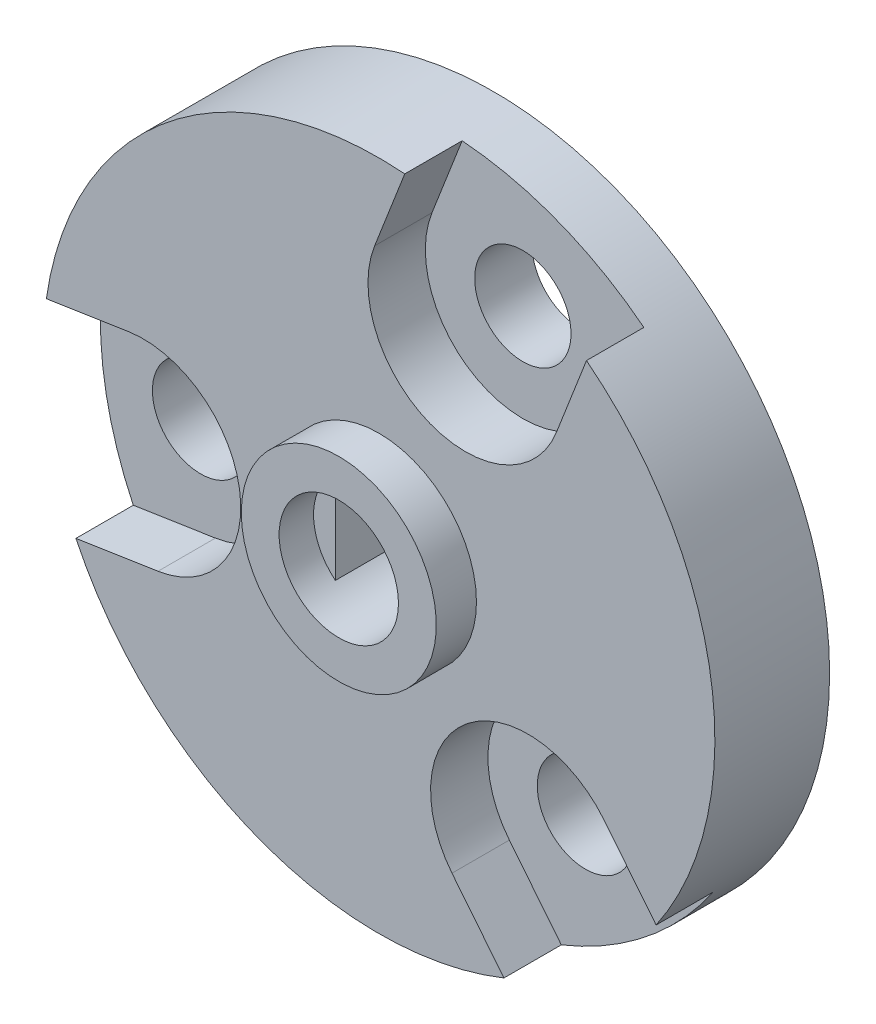
ISO-10303-21;
HEADER;
FILE_DESCRIPTION(('STEP AP214'),'2;1');
FILE_NAME('part.step','',(''),(''),'','','');
FILE_SCHEMA(('AUTOMOTIVE_DESIGN { 1 0 10303 214 1 1 1 1 }'));
ENDSEC;
DATA;
#1=APPLICATION_CONTEXT('core data for automotive mechanical design processes');
#2=APPLICATION_PROTOCOL_DEFINITION('international standard','automotive_design',2000,#1);
#3=PRODUCT_CONTEXT('',#1,'mechanical');
#4=PRODUCT('Part','Part','',(#3));
#5=PRODUCT_RELATED_PRODUCT_CATEGORY('part','',(#4));
#6=PRODUCT_DEFINITION_FORMATION('','',#4);
#7=PRODUCT_DEFINITION_CONTEXT('part definition',#1,'design');
#8=PRODUCT_DEFINITION('design','',#6,#7);
#9=PRODUCT_DEFINITION_SHAPE('','',#8);
#10=(LENGTH_UNIT() NAMED_UNIT(*) SI_UNIT(.MILLI.,.METRE.));
#11=(NAMED_UNIT(*) PLANE_ANGLE_UNIT() SI_UNIT($,.RADIAN.));
#12=(NAMED_UNIT(*) SI_UNIT($,.STERADIAN.) SOLID_ANGLE_UNIT());
#13=UNCERTAINTY_MEASURE_WITH_UNIT(LENGTH_MEASURE(1.E-05),#10,'distance_accuracy_value','');
#14=(GEOMETRIC_REPRESENTATION_CONTEXT(3) GLOBAL_UNCERTAINTY_ASSIGNED_CONTEXT((#13)) GLOBAL_UNIT_ASSIGNED_CONTEXT((#10,
#11,#12)) REPRESENTATION_CONTEXT('',''));
#15=CARTESIAN_POINT('',(0.,0.,0.));
#16=DIRECTION('',(0.,0.,1.));
#17=DIRECTION('',(1.,0.,0.));
#18=AXIS2_PLACEMENT_3D('',#15,#16,#17);
#19=CARTESIAN_POINT('',(0.,0.,5.25));
#20=DIRECTION('',(0.,0.,1.));
#21=DIRECTION('',(1.,0.,0.));
#22=AXIS2_PLACEMENT_3D('',#19,#20,#21);
#23=PLANE('',#22);
#24=CARTESIAN_POINT('',(0.,0.,5.25));
#25=DIRECTION('',(0.,0.,1.));
#26=DIRECTION('',(1.,0.,0.));
#27=AXIS2_PLACEMENT_3D('',#24,#25,#26);
#28=CIRCLE('',#27,2.6);
#29=CARTESIAN_POINT('',(1.65,-2.00935312974101,5.25));
#30=VERTEX_POINT('',#29);
#31=CARTESIAN_POINT('',(1.65,2.00935312974101,5.25));
#32=VERTEX_POINT('',#31);
#33=EDGE_CURVE('E164',#30,#32,#28,.T.);
#34=ORIENTED_EDGE('',*,*,#33,.T.);
#35=DIRECTION('',(0.,-1.,0.));
#36=VECTOR('',#35,1.);
#37=CARTESIAN_POINT('',(1.65,-2.00935312974102,5.25));
#38=LINE('',#37,#36);
#39=EDGE_CURVE('E150',#32,#30,#38,.T.);
#40=ORIENTED_EDGE('',*,*,#39,.T.);
#41=EDGE_LOOP('',(#34,#40));
#42=FACE_BOUND('',#41,.T.);
#43=ADVANCED_FACE('F36',(#42),#23,.T.);
#44=CARTESIAN_POINT('',(-1.65,2.00935312974101,5.25));
#45=VERTEX_POINT('',#44);
#46=CARTESIAN_POINT('',(-1.65,-2.00935312974101,5.25));
#47=VERTEX_POINT('',#46);
#48=EDGE_CURVE('E169',#45,#47,#28,.T.);
#49=ORIENTED_EDGE('',*,*,#48,.T.);
#50=DIRECTION('',(0.,1.,0.));
#51=VECTOR('',#50,1.);
#52=CARTESIAN_POINT('',(-1.65,2.00935312974101,5.25));
#53=LINE('',#52,#51);
#54=EDGE_CURVE('E168',#47,#45,#53,.T.);
#55=ORIENTED_EDGE('',*,*,#54,.T.);
#56=EDGE_LOOP('',(#49,#55));
#57=FACE_BOUND('',#56,.T.);
#58=ADVANCED_FACE('F348',(#57),#23,.T.);
#59=CARTESIAN_POINT('',(-10.272271600733,-1.5749400498987,5.));
#60=DIRECTION('',(0.,0.,1.));
#61=DIRECTION('',(1.,0.,0.));
#62=AXIS2_PLACEMENT_3D('',#59,#60,#61);
#63=PLANE('',#62);
#64=CARTESIAN_POINT('',(-10.272271600733,-1.5749400498987,5.));
#65=DIRECTION('',(0.,0.,-1.));
#66=DIRECTION('',(1.,0.,0.));
#67=AXIS2_PLACEMENT_3D('',#64,#65,#66);
#68=CIRCLE('',#67,4.24999999999999);
#69=CARTESIAN_POINT('',(-10.9163534778176,2.62597158159405,5.));
#70=VERTEX_POINT('',#69);
#71=CARTESIAN_POINT('',(-9.62818972364833,-5.77585168139145,5.));
#72=VERTEX_POINT('',#71);
#73=EDGE_CURVE('E301',#70,#72,#68,.T.);
#74=ORIENTED_EDGE('',*,*,#73,.T.);
#75=DIRECTION('',(-0.988449795645354,-0.151548676961091,0.));
#76=VECTOR('',#75,1.);
#77=CARTESIAN_POINT('',(-9.62818972364833,-5.77585168139145,5.));
#78=LINE('',#77,#76);
#79=CARTESIAN_POINT('',(-13.2060218892404,-6.32440329572032,5.));
#80=VERTEX_POINT('',#79);
#81=EDGE_CURVE('E299',#72,#80,#78,.T.);
#82=ORIENTED_EDGE('',*,*,#81,.T.);
#83=CARTESIAN_POINT('',(0.,0.,5.));
#84=DIRECTION('',(0.,0.,1.));
#85=DIRECTION('',(1.,0.,0.));
#86=AXIS2_PLACEMENT_3D('',#83,#84,#85);
#87=CIRCLE('',#86,14.6423048454133);
#88=CARTESIAN_POINT('',(5.44799435572411,-13.591042957993,5.));
#89=VERTEX_POINT('',#88);
#90=EDGE_CURVE('E297',#80,#89,#87,.T.);
#91=ORIENTED_EDGE('',*,*,#90,.T.);
#92=DIRECTION('',(-0.625469901980902,0.780248294913869,0.));
#93=VECTOR('',#92,1.);
#94=CARTESIAN_POINT('',(5.44799435572411,-13.591042957993,5.));
#95=LINE('',#94,#93);
#96=CARTESIAN_POINT('',(3.18401863963234,-10.7668252192777,5.));
#97=VERTEX_POINT('',#96);
#98=EDGE_CURVE('E295',#89,#97,#95,.T.);
#99=ORIENTED_EDGE('',*,*,#98,.T.);
#100=CARTESIAN_POINT('',(6.5000738930163,-8.10857813585883,5.));
#101=DIRECTION('',(0.,0.,-1.));
#102=DIRECTION('',(1.,0.,0.));
#103=AXIS2_PLACEMENT_3D('',#100,#101,#102);
#104=CIRCLE('',#103,4.25000000000001);
#105=CARTESIAN_POINT('',(9.81612914640025,-5.45033105243999,5.));
#106=VERTEX_POINT('',#105);
#107=EDGE_CURVE('E293',#97,#106,#104,.T.);
#108=ORIENTED_EDGE('',*,*,#107,.T.);
#109=DIRECTION('',(0.625469901980903,-0.780248294913869,0.));
#110=VECTOR('',#109,1.);
#111=CARTESIAN_POINT('',(12.080104862492,-8.27454879115533,5.));
#112=LINE('',#111,#110);
#113=CARTESIAN_POINT('',(12.080104862492,-8.27454879115533,5.));
#114=VERTEX_POINT('',#113);
#115=EDGE_CURVE('E291',#106,#114,#112,.T.);
#116=ORIENTED_EDGE('',*,*,#115,.T.);
#117=CARTESIAN_POINT('',(0.,0.,5.));
#118=DIRECTION('',(0.,0.,1.));
#119=DIRECTION('',(1.,0.,0.));
#120=AXIS2_PLACEMENT_3D('',#117,#118,#119);
#121=CIRCLE('',#120,14.6423048454133);
#122=CARTESIAN_POINT('',(9.04619128768549,11.5136229907278,5.));
#123=VERTEX_POINT('',#122);
#124=EDGE_CURVE('E289',#114,#123,#121,.T.);
#125=ORIENTED_EDGE('',*,*,#124,.T.);
#126=DIRECTION('',(-0.36297989366445,-0.93179697187496,0.));
#127=VECTOR('',#126,1.);
#128=CARTESIAN_POINT('',(9.04619128768549,11.5136229907278,5.));
#129=LINE('',#128,#127);
#130=CARTESIAN_POINT('',(7.73233483818526,8.14085363768363,5.));
#131=VERTEX_POINT('',#130);
#132=EDGE_CURVE('E287',#123,#131,#129,.T.);
#133=ORIENTED_EDGE('',*,*,#132,.T.);
#134=CARTESIAN_POINT('',(3.77219770771667,9.68351818575755,5.));
#135=DIRECTION('',(0.,0.,-1.));
#136=DIRECTION('',(1.,0.,0.));
#137=AXIS2_PLACEMENT_3D('',#134,#135,#136);
#138=CIRCLE('',#137,4.25000000000001);
#139=CARTESIAN_POINT('',(-0.187939422751923,11.2261827338315,5.));
#140=VERTEX_POINT('',#139);
#141=EDGE_CURVE('E285',#131,#140,#138,.T.);
#142=ORIENTED_EDGE('',*,*,#141,.T.);
#143=DIRECTION('',(0.362979893664451,0.931796971874959,0.));
#144=VECTOR('',#143,1.);
#145=CARTESIAN_POINT('',(1.12591702674831,14.5989520868757,5.));
#146=LINE('',#145,#144);
#147=CARTESIAN_POINT('',(1.12591702674831,14.5989520868757,5.));
#148=VERTEX_POINT('',#147);
#149=EDGE_CURVE('E283',#140,#148,#146,.T.);
#150=ORIENTED_EDGE('',*,*,#149,.T.);
#151=CARTESIAN_POINT('',(0.,0.,5.));
#152=DIRECTION('',(0.,0.,1.));
#153=DIRECTION('',(1.,0.,0.));
#154=AXIS2_PLACEMENT_3D('',#151,#152,#153);
#155=CIRCLE('',#154,14.6423048454133);
#156=CARTESIAN_POINT('',(-14.4941856434096,2.07741996726518,5.));
#157=VERTEX_POINT('',#156);
#158=EDGE_CURVE('E281',#148,#157,#155,.T.);
#159=ORIENTED_EDGE('',*,*,#158,.T.);
#160=DIRECTION('',(0.988449795645354,0.15154867696109,0.));
#161=VECTOR('',#160,1.);
#162=CARTESIAN_POINT('',(-10.9163534778176,2.62597158159405,5.));
#163=LINE('',#162,#161);
#164=EDGE_CURVE('E279',#157,#70,#163,.T.);
#165=ORIENTED_EDGE('',*,*,#164,.T.);
#166=EDGE_LOOP('',(#74,#82,#91,#99,#108,#116,#125,#133,#142,#150,#159,#165));
#167=FACE_BOUND('',#166,.T.);
#168=CARTESIAN_POINT('',(0.,0.,5.));
#169=DIRECTION('',(0.,0.,1.));
#170=DIRECTION('',(1.,0.,0.));
#171=AXIS2_PLACEMENT_3D('',#168,#169,#170);
#172=CIRCLE('',#171,4.25);
#173=CARTESIAN_POINT('',(4.25,0.,5.));
#174=VERTEX_POINT('',#173);
#175=EDGE_CURVE('E306',#174,#174,#172,.T.);
#176=ORIENTED_EDGE('',*,*,#175,.F.);
#177=EDGE_LOOP('',(#176));
#178=FACE_BOUND('',#177,.T.);
#179=ADVANCED_FACE('F350',(#167,#178),#63,.T.);
#180=CARTESIAN_POINT('',(0.,0.,2.5));
#181=DIRECTION('',(0.,0.,1.));
#182=DIRECTION('',(1.,0.,0.));
#183=AXIS2_PLACEMENT_3D('',#180,#181,#182);
#184=PLANE('',#183);
#185=CARTESIAN_POINT('',(3.77219770771667,9.68351818575755,2.5));
#186=DIRECTION('',(0.,0.,1.));
#187=DIRECTION('',(1.,0.,0.));
#188=AXIS2_PLACEMENT_3D('',#185,#186,#187);
#189=CIRCLE('',#188,2.1);
#190=CARTESIAN_POINT('',(5.87219770771667,9.68351818575755,2.5));
#191=VERTEX_POINT('',#190);
#192=EDGE_CURVE('E310',#191,#191,#189,.T.);
#193=ORIENTED_EDGE('',*,*,#192,.F.);
#194=EDGE_LOOP('',(#193));
#195=FACE_BOUND('',#194,.T.);
#196=DIRECTION('',(0.362979893664451,0.931796971874959,0.));
#197=VECTOR('',#196,1.);
#198=CARTESIAN_POINT('',(1.12591702674831,14.5989520868757,2.5));
#199=LINE('',#198,#197);
#200=CARTESIAN_POINT('',(-0.187939422751923,11.2261827338315,2.5));
#201=VERTEX_POINT('',#200);
#202=CARTESIAN_POINT('',(1.12591702674831,14.5989520868757,2.5));
#203=VERTEX_POINT('',#202);
#204=EDGE_CURVE('E219',#201,#203,#199,.T.);
#205=ORIENTED_EDGE('',*,*,#204,.F.);
#206=CARTESIAN_POINT('',(3.77219770771667,9.68351818575755,2.5));
#207=DIRECTION('',(0.,0.,-1.));
#208=DIRECTION('',(1.,0.,0.));
#209=AXIS2_PLACEMENT_3D('',#206,#207,#208);
#210=CIRCLE('',#209,4.25000000000001);
#211=CARTESIAN_POINT('',(7.73233483818526,8.14085363768363,2.5));
#212=VERTEX_POINT('',#211);
#213=EDGE_CURVE('E216',#212,#201,#210,.T.);
#214=ORIENTED_EDGE('',*,*,#213,.F.);
#215=DIRECTION('',(-0.36297989366445,-0.93179697187496,0.));
#216=VECTOR('',#215,1.);
#217=CARTESIAN_POINT('',(9.04619128768549,11.5136229907278,2.5));
#218=LINE('',#217,#216);
#219=CARTESIAN_POINT('',(9.04619128768549,11.5136229907278,2.5));
#220=VERTEX_POINT('',#219);
#221=EDGE_CURVE('E209',#220,#212,#218,.T.);
#222=ORIENTED_EDGE('',*,*,#221,.F.);
#223=CARTESIAN_POINT('',(0.,0.,2.5));
#224=DIRECTION('',(0.,0.,1.));
#225=DIRECTION('',(1.,0.,0.));
#226=AXIS2_PLACEMENT_3D('',#223,#224,#225);
#227=CIRCLE('',#226,14.6423048454133);
#228=EDGE_CURVE('E12',#220,#203,#227,.T.);
#229=ORIENTED_EDGE('',*,*,#228,.T.);
#230=EDGE_LOOP('',(#205,#214,#222,#229));
#231=FACE_BOUND('',#230,.T.);
#232=ADVANCED_FACE('F356',(#195,#231),#184,.T.);
#233=CARTESIAN_POINT('',(6.5000738930163,-8.10857813585883,2.5));
#234=DIRECTION('',(0.,0.,1.));
#235=DIRECTION('',(1.,0.,0.));
#236=AXIS2_PLACEMENT_3D('',#233,#234,#235);
#237=CIRCLE('',#236,2.1);
#238=CARTESIAN_POINT('',(8.6000738930163,-8.10857813585883,2.5));
#239=VERTEX_POINT('',#238);
#240=EDGE_CURVE('E173',#239,#239,#237,.T.);
#241=ORIENTED_EDGE('',*,*,#240,.F.);
#242=EDGE_LOOP('',(#241));
#243=FACE_BOUND('',#242,.T.);
#244=DIRECTION('',(0.625469901980903,-0.780248294913869,0.));
#245=VECTOR('',#244,1.);
#246=CARTESIAN_POINT('',(12.080104862492,-8.27454879115533,2.5));
#247=LINE('',#246,#245);
#248=CARTESIAN_POINT('',(9.81612914640025,-5.45033105243999,2.5));
#249=VERTEX_POINT('',#248);
#250=CARTESIAN_POINT('',(12.080104862492,-8.27454879115533,2.5));
#251=VERTEX_POINT('',#250);
#252=EDGE_CURVE('E205',#249,#251,#247,.T.);
#253=ORIENTED_EDGE('',*,*,#252,.F.);
#254=CARTESIAN_POINT('',(6.5000738930163,-8.10857813585883,2.5));
#255=DIRECTION('',(0.,0.,-1.));
#256=DIRECTION('',(1.,0.,0.));
#257=AXIS2_PLACEMENT_3D('',#254,#255,#256);
#258=CIRCLE('',#257,4.25000000000001);
#259=CARTESIAN_POINT('',(3.18401863963234,-10.7668252192777,2.5));
#260=VERTEX_POINT('',#259);
#261=EDGE_CURVE('E196',#260,#249,#258,.T.);
#262=ORIENTED_EDGE('',*,*,#261,.F.);
#263=DIRECTION('',(-0.625469901980902,0.780248294913869,0.));
#264=VECTOR('',#263,1.);
#265=CARTESIAN_POINT('',(5.44799435572411,-13.591042957993,2.5));
#266=LINE('',#265,#264);
#267=CARTESIAN_POINT('',(5.44799435572412,-13.591042957993,2.5));
#268=VERTEX_POINT('',#267);
#269=EDGE_CURVE('E193',#268,#260,#266,.T.);
#270=ORIENTED_EDGE('',*,*,#269,.F.);
#271=EDGE_CURVE('E262',#268,#251,#227,.T.);
#272=ORIENTED_EDGE('',*,*,#271,.T.);
#273=EDGE_LOOP('',(#253,#262,#270,#272));
#274=FACE_BOUND('',#273,.T.);
#275=ADVANCED_FACE('F421',(#243,#274),#184,.T.);
#276=CARTESIAN_POINT('',(0.,0.,2.5));
#277=DIRECTION('',(0.,0.,-1.));
#278=DIRECTION('',(-1.,0.,0.));
#279=AXIS2_PLACEMENT_3D('',#276,#277,#278);
#280=CYLINDRICAL_SURFACE('',#279,14.6423048454133);
#281=ORIENTED_EDGE('',*,*,#228,.F.);
#282=DIRECTION('',(0.,0.,-1.));
#283=VECTOR('',#282,1.);
#284=CARTESIAN_POINT('',(9.04619128768549,11.5136229907278,5.));
#285=LINE('',#284,#283);
#286=EDGE_CURVE('E204',#123,#220,#285,.T.);
#287=ORIENTED_EDGE('',*,*,#286,.F.);
#288=ORIENTED_EDGE('',*,*,#124,.F.);
#289=DIRECTION('',(0.,0.,-1.));
#290=VECTOR('',#289,1.);
#291=CARTESIAN_POINT('',(12.080104862492,-8.27454879115533,5.));
#292=LINE('',#291,#290);
#293=EDGE_CURVE('E200',#114,#251,#292,.T.);
#294=ORIENTED_EDGE('',*,*,#293,.T.);
#295=ORIENTED_EDGE('',*,*,#271,.F.);
#296=DIRECTION('',(0.,0.,-1.));
#297=VECTOR('',#296,1.);
#298=CARTESIAN_POINT('',(5.44799435572411,-13.591042957993,5.));
#299=LINE('',#298,#297);
#300=EDGE_CURVE('E186',#89,#268,#299,.T.);
#301=ORIENTED_EDGE('',*,*,#300,.F.);
#302=ORIENTED_EDGE('',*,*,#90,.F.);
#303=DIRECTION('',(0.,0.,-1.));
#304=VECTOR('',#303,1.);
#305=CARTESIAN_POINT('',(-13.2060218892404,-6.32440329572032,5.));
#306=LINE('',#305,#304);
#307=CARTESIAN_POINT('',(-13.2060218892404,-6.32440329572032,2.5));
#308=VERTEX_POINT('',#307);
#309=EDGE_CURVE('E189',#80,#308,#306,.T.);
#310=ORIENTED_EDGE('',*,*,#309,.T.);
#311=CARTESIAN_POINT('',(-14.4941856434096,2.07741996726518,2.5));
#312=VERTEX_POINT('',#311);
#313=EDGE_CURVE('E45',#312,#308,#227,.T.);
#314=ORIENTED_EDGE('',*,*,#313,.F.);
#315=DIRECTION('',(0.,0.,-1.));
#316=VECTOR('',#315,1.);
#317=CARTESIAN_POINT('',(-14.4941856434096,2.07741996726518,5.));
#318=LINE('',#317,#316);
#319=EDGE_CURVE('E235',#157,#312,#318,.T.);
#320=ORIENTED_EDGE('',*,*,#319,.F.);
#321=ORIENTED_EDGE('',*,*,#158,.F.);
#322=DIRECTION('',(0.,0.,-1.));
#323=VECTOR('',#322,1.);
#324=CARTESIAN_POINT('',(1.12591702674831,14.5989520868757,5.));
#325=LINE('',#324,#323);
#326=EDGE_CURVE('E231',#148,#203,#325,.T.);
#327=ORIENTED_EDGE('',*,*,#326,.T.);
#328=EDGE_LOOP('',(#281,#287,#288,#294,#295,#301,#302,#310,#314,#320,#321,#327));
#329=FACE_BOUND('',#328,.T.);
#330=CARTESIAN_POINT('',(0.,0.,0.));
#331=DIRECTION('',(0.,0.,1.));
#332=DIRECTION('',(1.,0.,0.));
#333=AXIS2_PLACEMENT_3D('',#330,#331,#332);
#334=CIRCLE('',#333,14.6423048454133);
#335=CARTESIAN_POINT('',(14.6423048454133,0.,0.));
#336=VERTEX_POINT('',#335);
#337=EDGE_CURVE('E260',#336,#336,#334,.T.);
#338=ORIENTED_EDGE('',*,*,#337,.T.);
#339=EDGE_LOOP('',(#338));
#340=FACE_BOUND('',#339,.T.);
#341=ADVANCED_FACE('F38',(#329,#340),#280,.T.);
#342=CARTESIAN_POINT('',(-10.272271600733,-1.5749400498987,2.5));
#343=DIRECTION('',(0.,0.,1.));
#344=DIRECTION('',(1.,0.,0.));
#345=AXIS2_PLACEMENT_3D('',#342,#343,#344);
#346=CIRCLE('',#345,2.1);
#347=CARTESIAN_POINT('',(-8.17227160073296,-1.5749400498987,2.5));
#348=VERTEX_POINT('',#347);
#349=EDGE_CURVE('E316',#348,#348,#346,.T.);
#350=ORIENTED_EDGE('',*,*,#349,.F.);
#351=EDGE_LOOP('',(#350));
#352=FACE_BOUND('',#351,.T.);
#353=DIRECTION('',(0.988449795645354,0.15154867696109,0.));
#354=VECTOR('',#353,1.);
#355=CARTESIAN_POINT('',(-10.9163534778176,2.62597158159405,2.5));
#356=LINE('',#355,#354);
#357=CARTESIAN_POINT('',(-10.9163534778176,2.62597158159405,2.5));
#358=VERTEX_POINT('',#357);
#359=EDGE_CURVE('E228',#312,#358,#356,.T.);
#360=ORIENTED_EDGE('',*,*,#359,.F.);
#361=ORIENTED_EDGE('',*,*,#313,.T.);
#362=DIRECTION('',(-0.988449795645354,-0.151548676961091,0.));
#363=VECTOR('',#362,1.);
#364=CARTESIAN_POINT('',(-9.62818972364833,-5.77585168139145,2.5));
#365=LINE('',#364,#363);
#366=CARTESIAN_POINT('',(-9.62818972364833,-5.77585168139145,2.5));
#367=VERTEX_POINT('',#366);
#368=EDGE_CURVE('E197',#367,#308,#365,.T.);
#369=ORIENTED_EDGE('',*,*,#368,.F.);
#370=CARTESIAN_POINT('',(-10.272271600733,-1.5749400498987,2.5));
#371=DIRECTION('',(0.,0.,-1.));
#372=DIRECTION('',(1.,0.,0.));
#373=AXIS2_PLACEMENT_3D('',#370,#371,#372);
#374=CIRCLE('',#373,4.24999999999999);
#375=EDGE_CURVE('E272',#358,#367,#374,.T.);
#376=ORIENTED_EDGE('',*,*,#375,.F.);
#377=EDGE_LOOP('',(#360,#361,#369,#376));
#378=FACE_BOUND('',#377,.T.);
#379=ADVANCED_FACE('F418',(#352,#378),#184,.T.);
#380=CARTESIAN_POINT('',(0.,0.,0.));
#381=DIRECTION('',(0.,0.,1.));
#382=DIRECTION('',(1.,0.,0.));
#383=AXIS2_PLACEMENT_3D('',#380,#381,#382);
#384=PLANE('',#383);
#385=DIRECTION('',(0.,-1.,0.));
#386=VECTOR('',#385,1.);
#387=CARTESIAN_POINT('',(1.65,-2.00935312974102,0.));
#388=LINE('',#387,#386);
#389=CARTESIAN_POINT('',(1.65,2.00935312974101,0.));
#390=VERTEX_POINT('',#389);
#391=CARTESIAN_POINT('',(1.65,-2.00935312974101,0.));
#392=VERTEX_POINT('',#391);
#393=EDGE_CURVE('E341',#390,#392,#388,.T.);
#394=ORIENTED_EDGE('',*,*,#393,.F.);
#395=CARTESIAN_POINT('',(0.,0.,0.));
#396=DIRECTION('',(0.,0.,1.));
#397=DIRECTION('',(1.,0.,0.));
#398=AXIS2_PLACEMENT_3D('',#395,#396,#397);
#399=CIRCLE('',#398,2.6);
#400=CARTESIAN_POINT('',(-1.65,2.00935312974101,0.));
#401=VERTEX_POINT('',#400);
#402=EDGE_CURVE('E166',#401,#390,#399,.F.);
#403=ORIENTED_EDGE('',*,*,#402,.F.);
#404=DIRECTION('',(0.,1.,0.));
#405=VECTOR('',#404,1.);
#406=CARTESIAN_POINT('',(-1.65,2.00935312974101,0.));
#407=LINE('',#406,#405);
#408=CARTESIAN_POINT('',(-1.65,-2.00935312974102,0.));
#409=VERTEX_POINT('',#408);
#410=EDGE_CURVE('E176',#409,#401,#407,.T.);
#411=ORIENTED_EDGE('',*,*,#410,.F.);
#412=CARTESIAN_POINT('',(0.,0.,0.));
#413=DIRECTION('',(0.,0.,1.));
#414=DIRECTION('',(1.,0.,0.));
#415=AXIS2_PLACEMENT_3D('',#412,#413,#414);
#416=CIRCLE('',#415,2.6);
#417=EDGE_CURVE('E61',#392,#409,#416,.F.);
#418=ORIENTED_EDGE('',*,*,#417,.F.);
#419=EDGE_LOOP('',(#394,#403,#411,#418));
#420=FACE_BOUND('',#419,.T.);
#421=CARTESIAN_POINT('',(6.5000738930163,-8.10857813585883,0.));
#422=DIRECTION('',(0.,0.,1.));
#423=DIRECTION('',(1.,0.,0.));
#424=AXIS2_PLACEMENT_3D('',#421,#422,#423);
#425=CIRCLE('',#424,2.1);
#426=CARTESIAN_POINT('',(8.6000738930163,-8.10857813585883,0.));
#427=VERTEX_POINT('',#426);
#428=EDGE_CURVE('E319',#427,#427,#425,.T.);
#429=ORIENTED_EDGE('',*,*,#428,.T.);
#430=EDGE_LOOP('',(#429));
#431=FACE_BOUND('',#430,.T.);
#432=CARTESIAN_POINT('',(-10.272271600733,-1.5749400498987,0.));
#433=DIRECTION('',(0.,0.,1.));
#434=DIRECTION('',(1.,0.,0.));
#435=AXIS2_PLACEMENT_3D('',#432,#433,#434);
#436=CIRCLE('',#435,2.1);
#437=CARTESIAN_POINT('',(-8.17227160073296,-1.5749400498987,0.));
#438=VERTEX_POINT('',#437);
#439=EDGE_CURVE('E313',#438,#438,#436,.T.);
#440=ORIENTED_EDGE('',*,*,#439,.T.);
#441=EDGE_LOOP('',(#440));
#442=FACE_BOUND('',#441,.T.);
#443=CARTESIAN_POINT('',(3.77219770771667,9.68351818575755,0.));
#444=DIRECTION('',(0.,0.,1.));
#445=DIRECTION('',(1.,0.,0.));
#446=AXIS2_PLACEMENT_3D('',#443,#444,#445);
#447=CIRCLE('',#446,2.1);
#448=CARTESIAN_POINT('',(5.87219770771667,9.68351818575755,0.));
#449=VERTEX_POINT('',#448);
#450=EDGE_CURVE('E309',#449,#449,#447,.T.);
#451=ORIENTED_EDGE('',*,*,#450,.T.);
#452=EDGE_LOOP('',(#451));
#453=FACE_BOUND('',#452,.T.);
#454=ORIENTED_EDGE('',*,*,#337,.F.);
#455=EDGE_LOOP('',(#454));
#456=FACE_BOUND('',#455,.T.);
#457=ADVANCED_FACE('F344',(#420,#431,#442,#453,#456),#384,.F.);
#458=CARTESIAN_POINT('',(-10.272271600733,-1.5749400498987,5.));
#459=DIRECTION('',(0.,0.,-1.));
#460=DIRECTION('',(-1.,0.,0.));
#461=AXIS2_PLACEMENT_3D('',#458,#459,#460);
#462=CYLINDRICAL_SURFACE('',#461,4.24999999999999);
#463=ORIENTED_EDGE('',*,*,#375,.T.);
#464=DIRECTION('',(0.,0.,-1.));
#465=VECTOR('',#464,1.);
#466=CARTESIAN_POINT('',(-9.62818972364833,-5.77585168139145,5.));
#467=LINE('',#466,#465);
#468=EDGE_CURVE('E257',#72,#367,#467,.T.);
#469=ORIENTED_EDGE('',*,*,#468,.F.);
#470=ORIENTED_EDGE('',*,*,#73,.F.);
#471=DIRECTION('',(0.,0.,-1.));
#472=VECTOR('',#471,1.);
#473=CARTESIAN_POINT('',(-10.9163534778176,2.62597158159405,5.));
#474=LINE('',#473,#472);
#475=EDGE_CURVE('E222',#70,#358,#474,.T.);
#476=ORIENTED_EDGE('',*,*,#475,.T.);
#477=EDGE_LOOP('',(#463,#469,#470,#476));
#478=FACE_BOUND('',#477,.T.);
#479=ADVANCED_FACE('F413',(#478),#462,.F.);
#480=CARTESIAN_POINT('',(-9.62818972364833,-5.77585168139145,5.));
#481=DIRECTION('',(0.151548676961091,-0.988449795645354,0.));
#482=DIRECTION('',(0.988449795645355,0.151548676961091,0.));
#483=AXIS2_PLACEMENT_3D('',#480,#481,#482);
#484=PLANE('',#483);
#485=ORIENTED_EDGE('',*,*,#368,.T.);
#486=ORIENTED_EDGE('',*,*,#309,.F.);
#487=ORIENTED_EDGE('',*,*,#81,.F.);
#488=ORIENTED_EDGE('',*,*,#468,.T.);
#489=EDGE_LOOP('',(#485,#486,#487,#488));
#490=FACE_BOUND('',#489,.T.);
#491=ADVANCED_FACE('F409',(#490),#484,.F.);
#492=CARTESIAN_POINT('',(5.44799435572411,-13.591042957993,5.));
#493=DIRECTION('',(-0.780248294913869,-0.625469901980903,0.));
#494=DIRECTION('',(0.625469901980903,-0.780248294913869,0.));
#495=AXIS2_PLACEMENT_3D('',#492,#493,#494);
#496=PLANE('',#495);
#497=ORIENTED_EDGE('',*,*,#269,.T.);
#498=DIRECTION('',(0.,0.,-1.));
#499=VECTOR('',#498,1.);
#500=CARTESIAN_POINT('',(3.18401863963234,-10.7668252192777,5.));
#501=LINE('',#500,#499);
#502=EDGE_CURVE('E190',#97,#260,#501,.T.);
#503=ORIENTED_EDGE('',*,*,#502,.F.);
#504=ORIENTED_EDGE('',*,*,#98,.F.);
#505=ORIENTED_EDGE('',*,*,#300,.T.);
#506=EDGE_LOOP('',(#497,#503,#504,#505));
#507=FACE_BOUND('',#506,.T.);
#508=ADVANCED_FACE('F405',(#507),#496,.F.);
#509=CARTESIAN_POINT('',(6.5000738930163,-8.10857813585883,5.));
#510=DIRECTION('',(0.,0.,-1.));
#511=DIRECTION('',(-1.,0.,0.));
#512=AXIS2_PLACEMENT_3D('',#509,#510,#511);
#513=CYLINDRICAL_SURFACE('',#512,4.25000000000001);
#514=ORIENTED_EDGE('',*,*,#261,.T.);
#515=DIRECTION('',(0.,0.,-1.));
#516=VECTOR('',#515,1.);
#517=CARTESIAN_POINT('',(9.81612914640025,-5.45033105243999,5.));
#518=LINE('',#517,#516);
#519=EDGE_CURVE('E203',#106,#249,#518,.T.);
#520=ORIENTED_EDGE('',*,*,#519,.F.);
#521=ORIENTED_EDGE('',*,*,#107,.F.);
#522=ORIENTED_EDGE('',*,*,#502,.T.);
#523=EDGE_LOOP('',(#514,#520,#521,#522));
#524=FACE_BOUND('',#523,.T.);
#525=ADVANCED_FACE('F401',(#524),#513,.F.);
#526=CARTESIAN_POINT('',(12.080104862492,-8.27454879115533,5.));
#527=DIRECTION('',(0.780248294913869,0.625469901980903,0.));
#528=DIRECTION('',(-0.625469901980903,0.780248294913869,0.));
#529=AXIS2_PLACEMENT_3D('',#526,#527,#528);
#530=PLANE('',#529);
#531=ORIENTED_EDGE('',*,*,#252,.T.);
#532=ORIENTED_EDGE('',*,*,#293,.F.);
#533=ORIENTED_EDGE('',*,*,#115,.F.);
#534=ORIENTED_EDGE('',*,*,#519,.T.);
#535=EDGE_LOOP('',(#531,#532,#533,#534));
#536=FACE_BOUND('',#535,.T.);
#537=ADVANCED_FACE('F398',(#536),#530,.F.);
#538=CARTESIAN_POINT('',(9.04619128768549,11.5136229907278,5.));
#539=DIRECTION('',(0.93179697187496,-0.36297989366445,0.));
#540=DIRECTION('',(0.36297989366445,0.93179697187496,0.));
#541=AXIS2_PLACEMENT_3D('',#538,#539,#540);
#542=PLANE('',#541);
#543=ORIENTED_EDGE('',*,*,#221,.T.);
#544=DIRECTION('',(0.,0.,-1.));
#545=VECTOR('',#544,1.);
#546=CARTESIAN_POINT('',(7.73233483818526,8.14085363768363,5.));
#547=LINE('',#546,#545);
#548=EDGE_CURVE('E242',#131,#212,#547,.T.);
#549=ORIENTED_EDGE('',*,*,#548,.F.);
#550=ORIENTED_EDGE('',*,*,#132,.F.);
#551=ORIENTED_EDGE('',*,*,#286,.T.);
#552=EDGE_LOOP('',(#543,#549,#550,#551));
#553=FACE_BOUND('',#552,.T.);
#554=ADVANCED_FACE('F395',(#553),#542,.F.);
#555=CARTESIAN_POINT('',(3.77219770771667,9.68351818575755,5.));
#556=DIRECTION('',(0.,0.,-1.));
#557=DIRECTION('',(-1.,0.,0.));
#558=AXIS2_PLACEMENT_3D('',#555,#556,#557);
#559=CYLINDRICAL_SURFACE('',#558,4.25000000000001);
#560=ORIENTED_EDGE('',*,*,#213,.T.);
#561=DIRECTION('',(0.,0.,-1.));
#562=VECTOR('',#561,1.);
#563=CARTESIAN_POINT('',(-0.187939422751923,11.2261827338315,5.));
#564=LINE('',#563,#562);
#565=EDGE_CURVE('E234',#140,#201,#564,.T.);
#566=ORIENTED_EDGE('',*,*,#565,.F.);
#567=ORIENTED_EDGE('',*,*,#141,.F.);
#568=ORIENTED_EDGE('',*,*,#548,.T.);
#569=EDGE_LOOP('',(#560,#566,#567,#568));
#570=FACE_BOUND('',#569,.T.);
#571=ADVANCED_FACE('F391',(#570),#559,.F.);
#572=CARTESIAN_POINT('',(1.12591702674831,14.5989520868757,5.));
#573=DIRECTION('',(-0.931796971874959,0.362979893664451,0.));
#574=DIRECTION('',(-0.362979893664451,-0.931796971874959,0.));
#575=AXIS2_PLACEMENT_3D('',#572,#573,#574);
#576=PLANE('',#575);
#577=ORIENTED_EDGE('',*,*,#204,.T.);
#578=ORIENTED_EDGE('',*,*,#326,.F.);
#579=ORIENTED_EDGE('',*,*,#149,.F.);
#580=ORIENTED_EDGE('',*,*,#565,.T.);
#581=EDGE_LOOP('',(#577,#578,#579,#580));
#582=FACE_BOUND('',#581,.T.);
#583=ADVANCED_FACE('F387',(#582),#576,.F.);
#584=CARTESIAN_POINT('',(-10.9163534778176,2.62597158159405,5.));
#585=DIRECTION('',(-0.15154867696109,0.988449795645355,0.));
#586=DIRECTION('',(-0.988449795645355,-0.15154867696109,0.));
#587=AXIS2_PLACEMENT_3D('',#584,#585,#586);
#588=PLANE('',#587);
#589=ORIENTED_EDGE('',*,*,#359,.T.);
#590=ORIENTED_EDGE('',*,*,#475,.F.);
#591=ORIENTED_EDGE('',*,*,#164,.F.);
#592=ORIENTED_EDGE('',*,*,#319,.T.);
#593=EDGE_LOOP('',(#589,#590,#591,#592));
#594=FACE_BOUND('',#593,.T.);
#595=ADVANCED_FACE('F382',(#594),#588,.F.);
#596=CARTESIAN_POINT('',(0.,0.,19.2708152801713));
#597=DIRECTION('',(0.,0.,-1.));
#598=DIRECTION('',(-1.,0.,0.));
#599=AXIS2_PLACEMENT_3D('',#596,#597,#598);
#600=CYLINDRICAL_SURFACE('',#599,4.25);
#601=CARTESIAN_POINT('',(0.,0.,6.75));
#602=DIRECTION('',(0.,0.,-1.));
#603=DIRECTION('',(-1.,0.,0.));
#604=AXIS2_PLACEMENT_3D('',#601,#602,#603);
#605=CIRCLE('',#604,4.25);
#606=CARTESIAN_POINT('',(-4.25,0.,6.75));
#607=VERTEX_POINT('',#606);
#608=EDGE_CURVE('E278',#607,#607,#605,.T.);
#609=ORIENTED_EDGE('',*,*,#608,.T.);
#610=EDGE_LOOP('',(#609));
#611=FACE_BOUND('',#610,.T.);
#612=ORIENTED_EDGE('',*,*,#175,.T.);
#613=EDGE_LOOP('',(#612));
#614=FACE_BOUND('',#613,.T.);
#615=ADVANCED_FACE('F379',(#611,#614),#600,.T.);
#616=CARTESIAN_POINT('',(0.,0.,6.75));
#617=DIRECTION('',(0.,0.,-1.));
#618=DIRECTION('',(-0.780248294913869,-0.625469901980903,0.));
#619=AXIS2_PLACEMENT_3D('',#616,#617,#618);
#620=PLANE('',#619);
#621=CARTESIAN_POINT('',(0.,0.,6.75));
#622=DIRECTION('',(0.,0.,1.));
#623=DIRECTION('',(1.,0.,0.));
#624=AXIS2_PLACEMENT_3D('',#621,#622,#623);
#625=CIRCLE('',#624,2.6);
#626=CARTESIAN_POINT('',(2.6,0.,6.75));
#627=VERTEX_POINT('',#626);
#628=EDGE_CURVE('E170',#627,#627,#625,.T.);
#629=ORIENTED_EDGE('',*,*,#628,.F.);
#630=EDGE_LOOP('',(#629));
#631=FACE_BOUND('',#630,.T.);
#632=ORIENTED_EDGE('',*,*,#608,.F.);
#633=EDGE_LOOP('',(#632));
#634=FACE_BOUND('',#633,.T.);
#635=ADVANCED_FACE('F375',(#631,#634),#620,.F.);
#636=CARTESIAN_POINT('',(3.77219770771667,9.68351818575755,0.));
#637=DIRECTION('',(0.,0.,1.));
#638=DIRECTION('',(1.,0.,0.));
#639=AXIS2_PLACEMENT_3D('',#636,#637,#638);
#640=CYLINDRICAL_SURFACE('',#639,2.1);
#641=ORIENTED_EDGE('',*,*,#450,.F.);
#642=EDGE_LOOP('',(#641));
#643=FACE_BOUND('',#642,.T.);
#644=ORIENTED_EDGE('',*,*,#192,.T.);
#645=EDGE_LOOP('',(#644));
#646=FACE_BOUND('',#645,.T.);
#647=ADVANCED_FACE('F371',(#643,#646),#640,.F.);
#648=CARTESIAN_POINT('',(-10.272271600733,-1.5749400498987,0.));
#649=DIRECTION('',(0.,0.,1.));
#650=DIRECTION('',(1.,0.,0.));
#651=AXIS2_PLACEMENT_3D('',#648,#649,#650);
#652=CYLINDRICAL_SURFACE('',#651,2.1);
#653=ORIENTED_EDGE('',*,*,#439,.F.);
#654=EDGE_LOOP('',(#653));
#655=FACE_BOUND('',#654,.T.);
#656=ORIENTED_EDGE('',*,*,#349,.T.);
#657=EDGE_LOOP('',(#656));
#658=FACE_BOUND('',#657,.T.);
#659=ADVANCED_FACE('F367',(#655,#658),#652,.F.);
#660=CARTESIAN_POINT('',(6.5000738930163,-8.10857813585883,0.));
#661=DIRECTION('',(0.,0.,1.));
#662=DIRECTION('',(1.,0.,0.));
#663=AXIS2_PLACEMENT_3D('',#660,#661,#662);
#664=CYLINDRICAL_SURFACE('',#663,2.1);
#665=ORIENTED_EDGE('',*,*,#428,.F.);
#666=EDGE_LOOP('',(#665));
#667=FACE_BOUND('',#666,.T.);
#668=ORIENTED_EDGE('',*,*,#240,.T.);
#669=EDGE_LOOP('',(#668));
#670=FACE_BOUND('',#669,.T.);
#671=ADVANCED_FACE('F364',(#667,#670),#664,.F.);
#672=CARTESIAN_POINT('',(0.,0.,5.25));
#673=DIRECTION('',(0.,0.,1.));
#674=DIRECTION('',(1.,0.,0.));
#675=AXIS2_PLACEMENT_3D('',#672,#673,#674);
#676=CYLINDRICAL_SURFACE('',#675,2.6);
#677=ORIENTED_EDGE('',*,*,#48,.F.);
#678=DIRECTION('',(0.,0.,1.));
#679=VECTOR('',#678,1.);
#680=CARTESIAN_POINT('',(-1.65,2.00935312974101,-0.00100000000000013));
#681=LINE('',#680,#679);
#682=EDGE_CURVE('E53',#401,#45,#681,.T.);
#683=ORIENTED_EDGE('',*,*,#682,.F.);
#684=ORIENTED_EDGE('',*,*,#402,.T.);
#685=DIRECTION('',(0.,0.,1.));
#686=VECTOR('',#685,1.);
#687=CARTESIAN_POINT('',(1.65,2.00935312974101,-0.00100000000000013));
#688=LINE('',#687,#686);
#689=EDGE_CURVE('E154',#390,#32,#688,.T.);
#690=ORIENTED_EDGE('',*,*,#689,.T.);
#691=ORIENTED_EDGE('',*,*,#33,.F.);
#692=DIRECTION('',(0.,0.,1.));
#693=VECTOR('',#692,1.);
#694=CARTESIAN_POINT('',(1.65,-2.00935312974101,-0.00100000000000013));
#695=LINE('',#694,#693);
#696=EDGE_CURVE('E156',#392,#30,#695,.T.);
#697=ORIENTED_EDGE('',*,*,#696,.F.);
#698=ORIENTED_EDGE('',*,*,#417,.T.);
#699=DIRECTION('',(0.,0.,1.));
#700=VECTOR('',#699,1.);
#701=CARTESIAN_POINT('',(-1.65,-2.00935312974102,-0.00100000000000013));
#702=LINE('',#701,#700);
#703=EDGE_CURVE('E333',#409,#47,#702,.T.);
#704=ORIENTED_EDGE('',*,*,#703,.T.);
#705=EDGE_LOOP('',(#677,#683,#684,#690,#691,#697,#698,#704));
#706=FACE_BOUND('',#705,.T.);
#707=ORIENTED_EDGE('',*,*,#628,.T.);
#708=EDGE_LOOP('',(#707));
#709=FACE_BOUND('',#708,.T.);
#710=ADVANCED_FACE('F162',(#706,#709),#676,.F.);
#711=CARTESIAN_POINT('',(1.65,-2.00935312974102,-0.00100000000000013));
#712=DIRECTION('',(1.,0.,0.));
#713=DIRECTION('',(0.,0.,-1.));
#714=AXIS2_PLACEMENT_3D('',#711,#712,#713);
#715=PLANE('',#714);
#716=ORIENTED_EDGE('',*,*,#393,.T.);
#717=ORIENTED_EDGE('',*,*,#696,.T.);
#718=ORIENTED_EDGE('',*,*,#39,.F.);
#719=ORIENTED_EDGE('',*,*,#689,.F.);
#720=EDGE_LOOP('',(#716,#717,#718,#719));
#721=FACE_BOUND('',#720,.T.);
#722=ADVANCED_FACE('F153',(#721),#715,.F.);
#723=CARTESIAN_POINT('',(-1.65,2.00935312974101,-0.00100000000000013));
#724=DIRECTION('',(-1.,0.,0.));
#725=DIRECTION('',(0.,0.,1.));
#726=AXIS2_PLACEMENT_3D('',#723,#724,#725);
#727=PLANE('',#726);
#728=ORIENTED_EDGE('',*,*,#410,.T.);
#729=ORIENTED_EDGE('',*,*,#682,.T.);
#730=ORIENTED_EDGE('',*,*,#54,.F.);
#731=ORIENTED_EDGE('',*,*,#703,.F.);
#732=EDGE_LOOP('',(#728,#729,#730,#731));
#733=FACE_BOUND('',#732,.T.);
#734=ADVANCED_FACE('F346',(#733),#727,.F.);
#735=CLOSED_SHELL('',(#43,#58,#179,#232,#275,#341,#379,#457,#479,#491,#508,#525,#537,#554,#571,
#583,#595,#615,#635,#647,#659,#671,#710,#722,#734));
#736=MANIFOLD_SOLID_BREP('B2',#735);
#737=ADVANCED_BREP_SHAPE_REPRESENTATION('',(#18,#736),#14);
#738=SHAPE_DEFINITION_REPRESENTATION(#9,#737);
ENDSEC;
END-ISO-10303-21;
